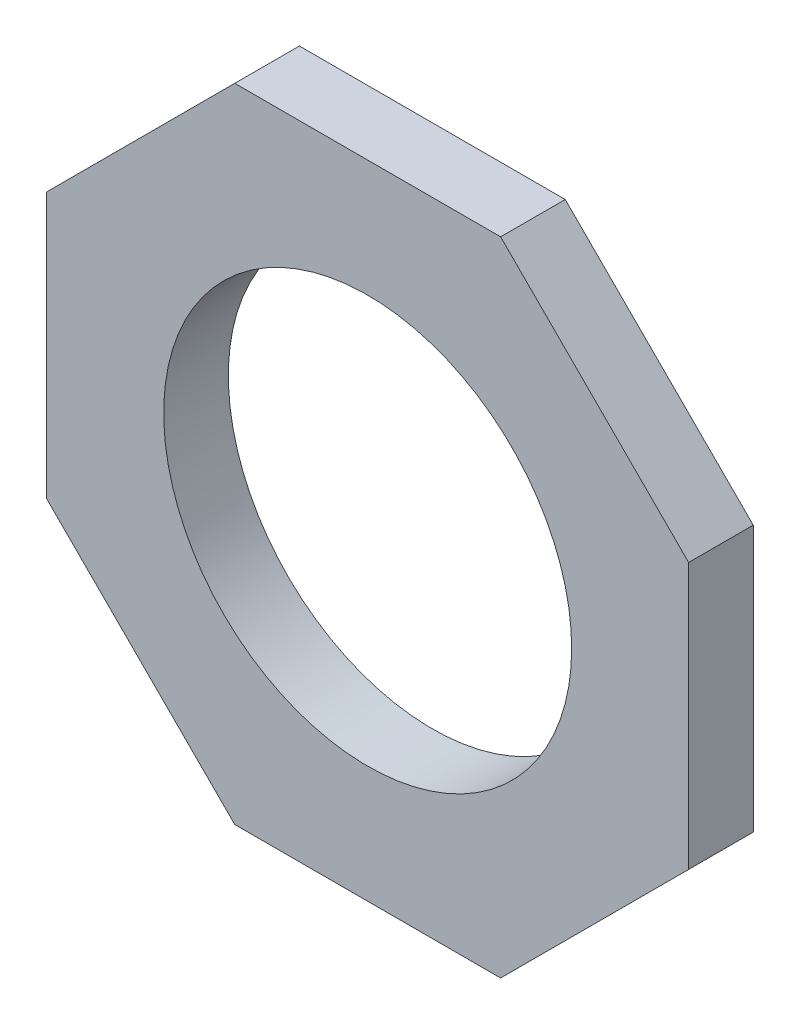
ISO-10303-21;
HEADER;
FILE_DESCRIPTION(('STEP AP214'),'2;1');
FILE_NAME('part.step','',(''),(''),'','','');
FILE_SCHEMA(('AUTOMOTIVE_DESIGN { 1 0 10303 214 1 1 1 1 }'));
ENDSEC;
DATA;
#1=APPLICATION_CONTEXT('core data for automotive mechanical design processes');
#2=APPLICATION_PROTOCOL_DEFINITION('international standard','automotive_design',2000,#1);
#3=PRODUCT_CONTEXT('',#1,'mechanical');
#4=PRODUCT('Part','Part','',(#3));
#5=PRODUCT_RELATED_PRODUCT_CATEGORY('part','',(#4));
#6=PRODUCT_DEFINITION_FORMATION('','',#4);
#7=PRODUCT_DEFINITION_CONTEXT('part definition',#1,'design');
#8=PRODUCT_DEFINITION('design','',#6,#7);
#9=PRODUCT_DEFINITION_SHAPE('','',#8);
#10=(LENGTH_UNIT() NAMED_UNIT(*) SI_UNIT(.MILLI.,.METRE.));
#11=(NAMED_UNIT(*) PLANE_ANGLE_UNIT() SI_UNIT($,.RADIAN.));
#12=(NAMED_UNIT(*) SI_UNIT($,.STERADIAN.) SOLID_ANGLE_UNIT());
#13=UNCERTAINTY_MEASURE_WITH_UNIT(LENGTH_MEASURE(1.E-05),#10,'distance_accuracy_value','');
#14=(GEOMETRIC_REPRESENTATION_CONTEXT(3) GLOBAL_UNCERTAINTY_ASSIGNED_CONTEXT((#13)) GLOBAL_UNIT_ASSIGNED_CONTEXT((#10,
#11,#12)) REPRESENTATION_CONTEXT('',''));
#15=CARTESIAN_POINT('',(0.,0.,0.));
#16=DIRECTION('',(0.,0.,1.));
#17=DIRECTION('',(1.,0.,0.));
#18=AXIS2_PLACEMENT_3D('',#15,#16,#17);
#19=CARTESIAN_POINT('',(0.,0.,1.6));
#20=DIRECTION('',(0.,0.,-1.));
#21=DIRECTION('',(-1.,0.,0.));
#22=AXIS2_PLACEMENT_3D('',#19,#20,#21);
#23=PLANE('',#22);
#24=DIRECTION('',(-0.707106781186547,0.707106781186547,0.));
#25=VECTOR('',#24,1.);
#26=CARTESIAN_POINT('',(3.29107751833977,7.94536397959707,1.6));
#27=LINE('',#26,#25);
#28=CARTESIAN_POINT('',(7.94536397959707,3.29107751833977,1.6));
#29=VERTEX_POINT('',#28);
#30=CARTESIAN_POINT('',(3.29107751833977,7.94536397959707,1.6));
#31=VERTEX_POINT('',#30);
#32=EDGE_CURVE('E166',#29,#31,#27,.T.);
#33=ORIENTED_EDGE('',*,*,#32,.T.);
#34=DIRECTION('',(-1.,0.,0.));
#35=VECTOR('',#34,1.);
#36=CARTESIAN_POINT('',(-3.29107751833977,7.94536397959707,1.6));
#37=LINE('',#36,#35);
#38=CARTESIAN_POINT('',(-3.29107751833977,7.94536397959707,1.6));
#39=VERTEX_POINT('',#38);
#40=EDGE_CURVE('E102',#31,#39,#37,.T.);
#41=ORIENTED_EDGE('',*,*,#40,.T.);
#42=DIRECTION('',(-0.707106781186547,-0.707106781186547,0.));
#43=VECTOR('',#42,1.);
#44=CARTESIAN_POINT('',(-7.94536397959707,3.29107751833977,1.6));
#45=LINE('',#44,#43);
#46=CARTESIAN_POINT('',(-7.94536397959707,3.29107751833977,1.6));
#47=VERTEX_POINT('',#46);
#48=EDGE_CURVE('E187',#39,#47,#45,.T.);
#49=ORIENTED_EDGE('',*,*,#48,.T.);
#50=DIRECTION('',(0.,-1.,0.));
#51=VECTOR('',#50,1.);
#52=CARTESIAN_POINT('',(-7.94536397959707,-3.29107751833977,1.6));
#53=LINE('',#52,#51);
#54=CARTESIAN_POINT('',(-7.94536397959707,-3.29107751833977,1.6));
#55=VERTEX_POINT('',#54);
#56=EDGE_CURVE('E201',#47,#55,#53,.T.);
#57=ORIENTED_EDGE('',*,*,#56,.T.);
#58=DIRECTION('',(0.707106781186547,-0.707106781186547,0.));
#59=VECTOR('',#58,1.);
#60=CARTESIAN_POINT('',(-3.29107751833977,-7.94536397959707,1.6));
#61=LINE('',#60,#59);
#62=CARTESIAN_POINT('',(-3.29107751833977,-7.94536397959707,1.6));
#63=VERTEX_POINT('',#62);
#64=EDGE_CURVE('E121',#55,#63,#61,.T.);
#65=ORIENTED_EDGE('',*,*,#64,.T.);
#66=DIRECTION('',(1.,0.,0.));
#67=VECTOR('',#66,1.);
#68=CARTESIAN_POINT('',(3.29107751833977,-7.94536397959707,1.6));
#69=LINE('',#68,#67);
#70=CARTESIAN_POINT('',(3.29107751833977,-7.94536397959707,1.6));
#71=VERTEX_POINT('',#70);
#72=EDGE_CURVE('E115',#63,#71,#69,.T.);
#73=ORIENTED_EDGE('',*,*,#72,.T.);
#74=DIRECTION('',(0.707106781186547,0.707106781186547,0.));
#75=VECTOR('',#74,1.);
#76=CARTESIAN_POINT('',(7.94536397959707,-3.29107751833977,1.6));
#77=LINE('',#76,#75);
#78=CARTESIAN_POINT('',(7.94536397959707,-3.29107751833977,1.6));
#79=VERTEX_POINT('',#78);
#80=EDGE_CURVE('E119',#71,#79,#77,.T.);
#81=ORIENTED_EDGE('',*,*,#80,.T.);
#82=DIRECTION('',(0.,1.,0.));
#83=VECTOR('',#82,1.);
#84=CARTESIAN_POINT('',(7.94536397959707,3.29107751833977,1.6));
#85=LINE('',#84,#83);
#86=EDGE_CURVE('E59',#79,#29,#85,.T.);
#87=ORIENTED_EDGE('',*,*,#86,.T.);
#88=EDGE_LOOP('',(#33,#41,#49,#57,#65,#73,#81,#87));
#89=FACE_BOUND('',#88,.T.);
#90=CARTESIAN_POINT('',(0.,0.,1.6));
#91=DIRECTION('',(0.,0.,1.));
#92=DIRECTION('',(1.,0.,0.));
#93=AXIS2_PLACEMENT_3D('',#90,#91,#92);
#94=CIRCLE('',#93,5.05);
#95=CARTESIAN_POINT('',(5.05,0.,1.6));
#96=VERTEX_POINT('',#95);
#97=EDGE_CURVE('E148',#96,#96,#94,.T.);
#98=ORIENTED_EDGE('',*,*,#97,.F.);
#99=EDGE_LOOP('',(#98));
#100=FACE_BOUND('',#99,.T.);
#101=ADVANCED_FACE('F41',(#89,#100),#23,.F.);
#102=CARTESIAN_POINT('',(0.,0.,0.));
#103=DIRECTION('',(0.,0.,-1.));
#104=DIRECTION('',(-1.,0.,0.));
#105=AXIS2_PLACEMENT_3D('',#102,#103,#104);
#106=PLANE('',#105);
#107=DIRECTION('',(-0.707106781186547,0.707106781186547,0.));
#108=VECTOR('',#107,1.);
#109=CARTESIAN_POINT('',(3.29107751833977,7.94536397959707,0.));
#110=LINE('',#109,#108);
#111=CARTESIAN_POINT('',(7.94536397959707,3.29107751833977,0.));
#112=VERTEX_POINT('',#111);
#113=CARTESIAN_POINT('',(3.29107751833977,7.94536397959707,0.));
#114=VERTEX_POINT('',#113);
#115=EDGE_CURVE('E143',#112,#114,#110,.T.);
#116=ORIENTED_EDGE('',*,*,#115,.F.);
#117=DIRECTION('',(0.,1.,0.));
#118=VECTOR('',#117,1.);
#119=CARTESIAN_POINT('',(7.94536397959707,3.29107751833977,0.));
#120=LINE('',#119,#118);
#121=CARTESIAN_POINT('',(7.94536397959707,-3.29107751833977,0.));
#122=VERTEX_POINT('',#121);
#123=EDGE_CURVE('E94',#122,#112,#120,.T.);
#124=ORIENTED_EDGE('',*,*,#123,.F.);
#125=DIRECTION('',(0.707106781186547,0.707106781186547,0.));
#126=VECTOR('',#125,1.);
#127=CARTESIAN_POINT('',(7.94536397959707,-3.29107751833977,0.));
#128=LINE('',#127,#126);
#129=CARTESIAN_POINT('',(3.29107751833977,-7.94536397959707,0.));
#130=VERTEX_POINT('',#129);
#131=EDGE_CURVE('E88',#130,#122,#128,.T.);
#132=ORIENTED_EDGE('',*,*,#131,.F.);
#133=DIRECTION('',(1.,0.,0.));
#134=VECTOR('',#133,1.);
#135=CARTESIAN_POINT('',(3.29107751833977,-7.94536397959707,0.));
#136=LINE('',#135,#134);
#137=CARTESIAN_POINT('',(-3.29107751833977,-7.94536397959707,0.));
#138=VERTEX_POINT('',#137);
#139=EDGE_CURVE('E130',#138,#130,#136,.T.);
#140=ORIENTED_EDGE('',*,*,#139,.F.);
#141=DIRECTION('',(0.707106781186547,-0.707106781186547,0.));
#142=VECTOR('',#141,1.);
#143=CARTESIAN_POINT('',(-3.29107751833977,-7.94536397959707,0.));
#144=LINE('',#143,#142);
#145=CARTESIAN_POINT('',(-7.94536397959707,-3.29107751833977,0.));
#146=VERTEX_POINT('',#145);
#147=EDGE_CURVE('E157',#146,#138,#144,.T.);
#148=ORIENTED_EDGE('',*,*,#147,.F.);
#149=DIRECTION('',(0.,-1.,0.));
#150=VECTOR('',#149,1.);
#151=CARTESIAN_POINT('',(-7.94536397959707,-3.29107751833977,0.));
#152=LINE('',#151,#150);
#153=CARTESIAN_POINT('',(-7.94536397959707,3.29107751833977,0.));
#154=VERTEX_POINT('',#153);
#155=EDGE_CURVE('E154',#154,#146,#152,.T.);
#156=ORIENTED_EDGE('',*,*,#155,.F.);
#157=DIRECTION('',(-0.707106781186547,-0.707106781186547,0.));
#158=VECTOR('',#157,1.);
#159=CARTESIAN_POINT('',(-7.94536397959707,3.29107751833977,0.));
#160=LINE('',#159,#158);
#161=CARTESIAN_POINT('',(-3.29107751833977,7.94536397959707,0.));
#162=VERTEX_POINT('',#161);
#163=EDGE_CURVE('E151',#162,#154,#160,.T.);
#164=ORIENTED_EDGE('',*,*,#163,.F.);
#165=DIRECTION('',(-1.,0.,0.));
#166=VECTOR('',#165,1.);
#167=CARTESIAN_POINT('',(-3.29107751833977,7.94536397959707,0.));
#168=LINE('',#167,#166);
#169=EDGE_CURVE('E147',#114,#162,#168,.T.);
#170=ORIENTED_EDGE('',*,*,#169,.F.);
#171=EDGE_LOOP('',(#116,#124,#132,#140,#148,#156,#164,#170));
#172=FACE_BOUND('',#171,.T.);
#173=CARTESIAN_POINT('',(0.,0.,0.));
#174=DIRECTION('',(0.,0.,1.));
#175=DIRECTION('',(1.,0.,0.));
#176=AXIS2_PLACEMENT_3D('',#173,#174,#175);
#177=CIRCLE('',#176,5.05);
#178=CARTESIAN_POINT('',(5.05,0.,0.));
#179=VERTEX_POINT('',#178);
#180=EDGE_CURVE('E211',#179,#179,#177,.T.);
#181=ORIENTED_EDGE('',*,*,#180,.T.);
#182=EDGE_LOOP('',(#181));
#183=FACE_BOUND('',#182,.T.);
#184=ADVANCED_FACE('F191',(#172,#183),#106,.T.);
#185=CARTESIAN_POINT('',(3.29107751833977,7.94536397959707,1.6));
#186=DIRECTION('',(-0.707106781186548,-0.707106781186548,0.));
#187=DIRECTION('',(0.707106781186548,-0.707106781186548,0.));
#188=AXIS2_PLACEMENT_3D('',#185,#186,#187);
#189=PLANE('',#188);
#190=ORIENTED_EDGE('',*,*,#115,.T.);
#191=DIRECTION('',(0.,0.,-1.));
#192=VECTOR('',#191,1.);
#193=CARTESIAN_POINT('',(3.29107751833977,7.94536397959707,1.6));
#194=LINE('',#193,#192);
#195=EDGE_CURVE('E11',#31,#114,#194,.T.);
#196=ORIENTED_EDGE('',*,*,#195,.F.);
#197=ORIENTED_EDGE('',*,*,#32,.F.);
#198=DIRECTION('',(0.,0.,-1.));
#199=VECTOR('',#198,1.);
#200=CARTESIAN_POINT('',(7.94536397959707,3.29107751833977,1.6));
#201=LINE('',#200,#199);
#202=EDGE_CURVE('E139',#29,#112,#201,.T.);
#203=ORIENTED_EDGE('',*,*,#202,.T.);
#204=EDGE_LOOP('',(#190,#196,#197,#203));
#205=FACE_BOUND('',#204,.T.);
#206=ADVANCED_FACE('F43',(#205),#189,.F.);
#207=CARTESIAN_POINT('',(-3.29107751833977,7.94536397959707,1.6));
#208=DIRECTION('',(0.,-1.,0.));
#209=DIRECTION('',(0.,0.,-1.));
#210=AXIS2_PLACEMENT_3D('',#207,#208,#209);
#211=PLANE('',#210);
#212=ORIENTED_EDGE('',*,*,#169,.T.);
#213=DIRECTION('',(0.,0.,-1.));
#214=VECTOR('',#213,1.);
#215=CARTESIAN_POINT('',(-3.29107751833977,7.94536397959707,1.6));
#216=LINE('',#215,#214);
#217=EDGE_CURVE('E51',#39,#162,#216,.T.);
#218=ORIENTED_EDGE('',*,*,#217,.F.);
#219=ORIENTED_EDGE('',*,*,#40,.F.);
#220=ORIENTED_EDGE('',*,*,#195,.T.);
#221=EDGE_LOOP('',(#212,#218,#219,#220));
#222=FACE_BOUND('',#221,.T.);
#223=ADVANCED_FACE('F241',(#222),#211,.F.);
#224=CARTESIAN_POINT('',(-7.94536397959707,3.29107751833977,1.6));
#225=DIRECTION('',(0.707106781186548,-0.707106781186548,0.));
#226=DIRECTION('',(0.707106781186548,0.707106781186548,0.));
#227=AXIS2_PLACEMENT_3D('',#224,#225,#226);
#228=PLANE('',#227);
#229=ORIENTED_EDGE('',*,*,#163,.T.);
#230=DIRECTION('',(0.,0.,-1.));
#231=VECTOR('',#230,1.);
#232=CARTESIAN_POINT('',(-7.94536397959707,3.29107751833977,1.6));
#233=LINE('',#232,#231);
#234=EDGE_CURVE('E177',#47,#154,#233,.T.);
#235=ORIENTED_EDGE('',*,*,#234,.F.);
#236=ORIENTED_EDGE('',*,*,#48,.F.);
#237=ORIENTED_EDGE('',*,*,#217,.T.);
#238=EDGE_LOOP('',(#229,#235,#236,#237));
#239=FACE_BOUND('',#238,.T.);
#240=ADVANCED_FACE('F185',(#239),#228,.F.);
#241=CARTESIAN_POINT('',(-7.94536397959707,-3.29107751833977,1.6));
#242=DIRECTION('',(1.,0.,0.));
#243=DIRECTION('',(0.,0.,-1.));
#244=AXIS2_PLACEMENT_3D('',#241,#242,#243);
#245=PLANE('',#244);
#246=ORIENTED_EDGE('',*,*,#155,.T.);
#247=DIRECTION('',(0.,0.,-1.));
#248=VECTOR('',#247,1.);
#249=CARTESIAN_POINT('',(-7.94536397959707,-3.29107751833977,1.6));
#250=LINE('',#249,#248);
#251=EDGE_CURVE('E173',#55,#146,#250,.T.);
#252=ORIENTED_EDGE('',*,*,#251,.F.);
#253=ORIENTED_EDGE('',*,*,#56,.F.);
#254=ORIENTED_EDGE('',*,*,#234,.T.);
#255=EDGE_LOOP('',(#246,#252,#253,#254));
#256=FACE_BOUND('',#255,.T.);
#257=ADVANCED_FACE('F196',(#256),#245,.F.);
#258=CARTESIAN_POINT('',(-3.29107751833977,-7.94536397959707,1.6));
#259=DIRECTION('',(0.707106781186548,0.707106781186548,0.));
#260=DIRECTION('',(-0.707106781186548,0.707106781186548,0.));
#261=AXIS2_PLACEMENT_3D('',#258,#259,#260);
#262=PLANE('',#261);
#263=ORIENTED_EDGE('',*,*,#147,.T.);
#264=DIRECTION('',(0.,0.,-1.));
#265=VECTOR('',#264,1.);
#266=CARTESIAN_POINT('',(-3.29107751833977,-7.94536397959707,1.6));
#267=LINE('',#266,#265);
#268=EDGE_CURVE('E132',#63,#138,#267,.T.);
#269=ORIENTED_EDGE('',*,*,#268,.F.);
#270=ORIENTED_EDGE('',*,*,#64,.F.);
#271=ORIENTED_EDGE('',*,*,#251,.T.);
#272=EDGE_LOOP('',(#263,#269,#270,#271));
#273=FACE_BOUND('',#272,.T.);
#274=ADVANCED_FACE('F199',(#273),#262,.F.);
#275=CARTESIAN_POINT('',(3.29107751833977,-7.94536397959707,1.6));
#276=DIRECTION('',(0.,1.,0.));
#277=DIRECTION('',(0.,0.,1.));
#278=AXIS2_PLACEMENT_3D('',#275,#276,#277);
#279=PLANE('',#278);
#280=ORIENTED_EDGE('',*,*,#139,.T.);
#281=DIRECTION('',(0.,0.,-1.));
#282=VECTOR('',#281,1.);
#283=CARTESIAN_POINT('',(3.29107751833977,-7.94536397959707,1.6));
#284=LINE('',#283,#282);
#285=EDGE_CURVE('E127',#71,#130,#284,.T.);
#286=ORIENTED_EDGE('',*,*,#285,.F.);
#287=ORIENTED_EDGE('',*,*,#72,.F.);
#288=ORIENTED_EDGE('',*,*,#268,.T.);
#289=EDGE_LOOP('',(#280,#286,#287,#288));
#290=FACE_BOUND('',#289,.T.);
#291=ADVANCED_FACE('F128',(#290),#279,.F.);
#292=CARTESIAN_POINT('',(7.94536397959707,-3.29107751833977,1.6));
#293=DIRECTION('',(-0.707106781186548,0.707106781186548,0.));
#294=DIRECTION('',(-0.707106781186548,-0.707106781186548,0.));
#295=AXIS2_PLACEMENT_3D('',#292,#293,#294);
#296=PLANE('',#295);
#297=ORIENTED_EDGE('',*,*,#131,.T.);
#298=DIRECTION('',(0.,0.,-1.));
#299=VECTOR('',#298,1.);
#300=CARTESIAN_POINT('',(7.94536397959707,-3.29107751833977,1.6));
#301=LINE('',#300,#299);
#302=EDGE_CURVE('E133',#79,#122,#301,.T.);
#303=ORIENTED_EDGE('',*,*,#302,.F.);
#304=ORIENTED_EDGE('',*,*,#80,.F.);
#305=ORIENTED_EDGE('',*,*,#285,.T.);
#306=EDGE_LOOP('',(#297,#303,#304,#305));
#307=FACE_BOUND('',#306,.T.);
#308=ADVANCED_FACE('F135',(#307),#296,.F.);
#309=CARTESIAN_POINT('',(7.94536397959707,3.29107751833977,1.6));
#310=DIRECTION('',(-1.,0.,0.));
#311=DIRECTION('',(0.,0.,1.));
#312=AXIS2_PLACEMENT_3D('',#309,#310,#311);
#313=PLANE('',#312);
#314=ORIENTED_EDGE('',*,*,#123,.T.);
#315=ORIENTED_EDGE('',*,*,#202,.F.);
#316=ORIENTED_EDGE('',*,*,#86,.F.);
#317=ORIENTED_EDGE('',*,*,#302,.T.);
#318=EDGE_LOOP('',(#314,#315,#316,#317));
#319=FACE_BOUND('',#318,.T.);
#320=ADVANCED_FACE('F229',(#319),#313,.F.);
#321=CARTESIAN_POINT('',(0.,0.,1.6));
#322=DIRECTION('',(0.,0.,-1.));
#323=DIRECTION('',(-1.,0.,0.));
#324=AXIS2_PLACEMENT_3D('',#321,#322,#323);
#325=CYLINDRICAL_SURFACE('',#324,5.05);
#326=ORIENTED_EDGE('',*,*,#97,.T.);
#327=EDGE_LOOP('',(#326));
#328=FACE_BOUND('',#327,.T.);
#329=ORIENTED_EDGE('',*,*,#180,.F.);
#330=EDGE_LOOP('',(#329));
#331=FACE_BOUND('',#330,.T.);
#332=ADVANCED_FACE('F219',(#328,#331),#325,.F.);
#333=CLOSED_SHELL('',(#101,#184,#206,#223,#240,#257,#274,#291,#308,#320,#332));
#334=MANIFOLD_SOLID_BREP('B2',#333);
#335=ADVANCED_BREP_SHAPE_REPRESENTATION('',(#18,#334),#14);
#336=SHAPE_DEFINITION_REPRESENTATION(#9,#335);
ENDSEC;
END-ISO-10303-21;
